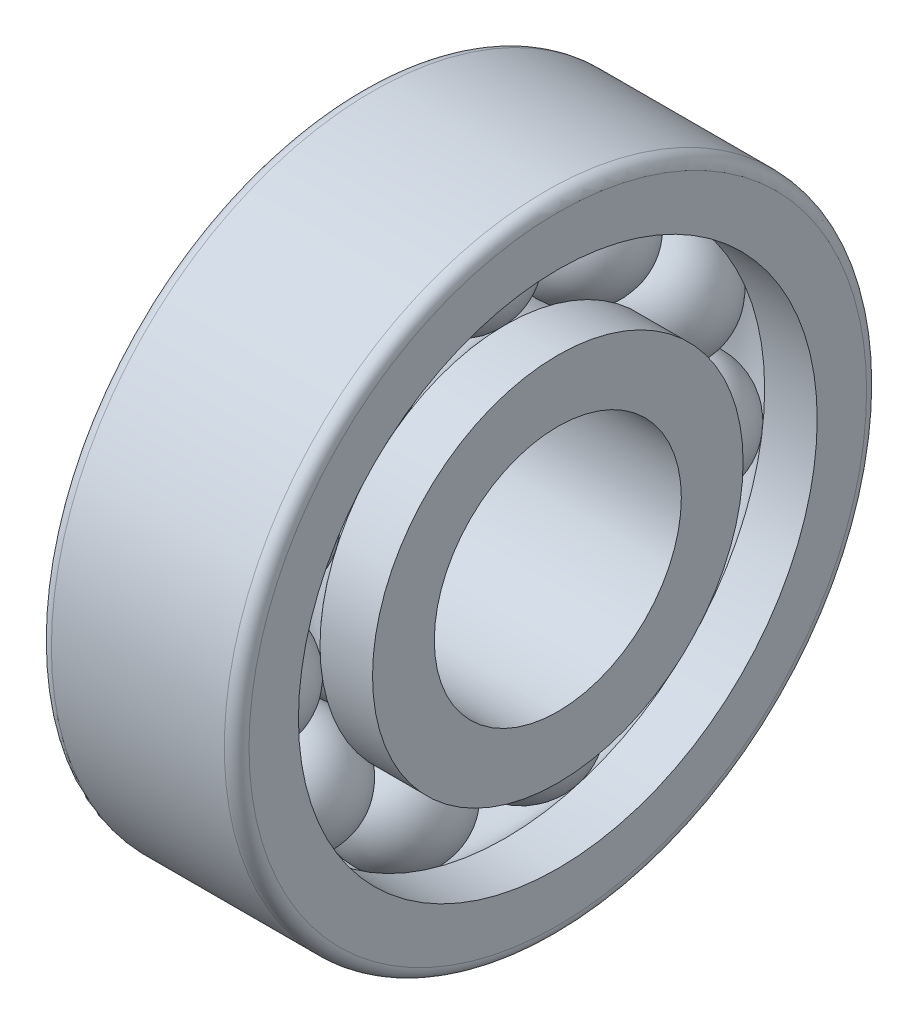
ISO-10303-21;
HEADER;
FILE_DESCRIPTION(('STEP AP214'),'2;1');
FILE_NAME('part.step','',(''),(''),'','','');
FILE_SCHEMA(('AUTOMOTIVE_DESIGN { 1 0 10303 214 1 1 1 1 }'));
ENDSEC;
DATA;
#1=APPLICATION_CONTEXT('core data for automotive mechanical design processes');
#2=APPLICATION_PROTOCOL_DEFINITION('international standard','automotive_design',2000,#1);
#3=PRODUCT_CONTEXT('',#1,'mechanical');
#4=PRODUCT('Part','Part','',(#3));
#5=PRODUCT_RELATED_PRODUCT_CATEGORY('part','',(#4));
#6=PRODUCT_DEFINITION_FORMATION('','',#4);
#7=PRODUCT_DEFINITION_CONTEXT('part definition',#1,'design');
#8=PRODUCT_DEFINITION('design','',#6,#7);
#9=PRODUCT_DEFINITION_SHAPE('','',#8);
#10=(LENGTH_UNIT() NAMED_UNIT(*) SI_UNIT(.MILLI.,.METRE.));
#11=(NAMED_UNIT(*) PLANE_ANGLE_UNIT() SI_UNIT($,.RADIAN.));
#12=(NAMED_UNIT(*) SI_UNIT($,.STERADIAN.) SOLID_ANGLE_UNIT());
#13=UNCERTAINTY_MEASURE_WITH_UNIT(LENGTH_MEASURE(1.E-05),#10,'distance_accuracy_value','');
#14=(GEOMETRIC_REPRESENTATION_CONTEXT(3) GLOBAL_UNCERTAINTY_ASSIGNED_CONTEXT((#13)) GLOBAL_UNIT_ASSIGNED_CONTEXT((#10,
#11,#12)) REPRESENTATION_CONTEXT('',''));
#15=CARTESIAN_POINT('',(0.,0.,0.));
#16=DIRECTION('',(0.,0.,1.));
#17=DIRECTION('',(1.,0.,0.));
#18=AXIS2_PLACEMENT_3D('',#15,#16,#17);
#19=CARTESIAN_POINT('',(-4.,7.57128179548069,-4.86576735710028));
#20=DIRECTION('',(-1.,0.,0.));
#21=DIRECTION('',(0.,0.841253532831188,-0.540640817455586));
#22=AXIS2_PLACEMENT_3D('',#19,#20,#21);
#23=SPHERICAL_SURFACE('',#22,2.4);
#24=CARTESIAN_POINT('',(-6.4,7.57128179548069,-4.86576735710028));
#25=VERTEX_POINT('',#24);
#26=VERTEX_LOOP('',#25);
#27=FACE_BOUND('',#26,.T.);
#28=ADVANCED_FACE('F39',(#27),#23,.T.);
#29=CLOSED_SHELL('',(#28));
#30=MANIFOLD_SOLID_BREP('B2',#29);
#31=CARTESIAN_POINT('',(-4.,3.73873511701707,-8.18668795819062));
#32=DIRECTION('',(-1.,0.,0.));
#33=DIRECTION('',(0.,0.415415013001897,-0.909631995354513));
#34=AXIS2_PLACEMENT_3D('',#31,#32,#33);
#35=SPHERICAL_SURFACE('',#34,2.4);
#36=CARTESIAN_POINT('',(-6.4,3.73873511701707,-8.18668795819062));
#37=VERTEX_POINT('',#36);
#38=VERTEX_LOOP('',#37);
#39=FACE_BOUND('',#38,.T.);
#40=ADVANCED_FACE('F59',(#39),#35,.T.);
#41=CLOSED_SHELL('',(#40));
#42=MANIFOLD_SOLID_BREP('B6',#41);
#43=CARTESIAN_POINT('',(-4.,-1.28083354445947,-8.90839297692841));
#44=DIRECTION('',(-1.,0.,0.));
#45=DIRECTION('',(0.,-0.142314838273275,-0.989821441880934));
#46=AXIS2_PLACEMENT_3D('',#43,#44,#45);
#47=SPHERICAL_SURFACE('',#46,2.4);
#48=CARTESIAN_POINT('',(-6.4,-1.28083354445947,-8.90839297692841));
#49=VERTEX_POINT('',#48);
#50=VERTEX_LOOP('',#49);
#51=FACE_BOUND('',#50,.T.);
#52=ADVANCED_FACE('F79',(#51),#47,.T.);
#53=CLOSED_SHELL('',(#52));
#54=MANIFOLD_SOLID_BREP('B35',#53);
#55=CARTESIAN_POINT('',(-4.,-5.8937466055075,-6.80174616918838));
#56=DIRECTION('',(-1.,0.,0.));
#57=DIRECTION('',(0.,-0.654860733945278,-0.755749574354264));
#58=AXIS2_PLACEMENT_3D('',#55,#56,#57);
#59=SPHERICAL_SURFACE('',#58,2.4);
#60=CARTESIAN_POINT('',(-6.4,-5.8937466055075,-6.80174616918838));
#61=VERTEX_POINT('',#60);
#62=VERTEX_LOOP('',#61);
#63=FACE_BOUND('',#62,.T.);
#64=ADVANCED_FACE('F99',(#63),#59,.T.);
#65=CLOSED_SHELL('',(#64));
#66=MANIFOLD_SOLID_BREP('B55',#65);
#67=CARTESIAN_POINT('',(-4.,-8.63543676253046,-2.53559301157293));
#68=DIRECTION('',(-1.,0.,0.));
#69=DIRECTION('',(0.,-0.959492973614495,-0.281732556841437));
#70=AXIS2_PLACEMENT_3D('',#67,#68,#69);
#71=SPHERICAL_SURFACE('',#70,2.4);
#72=CARTESIAN_POINT('',(-6.4,-8.63543676253046,-2.53559301157293));
#73=VERTEX_POINT('',#72);
#74=VERTEX_LOOP('',#73);
#75=FACE_BOUND('',#74,.T.);
#76=ADVANCED_FACE('F119',(#75),#71,.T.);
#77=CLOSED_SHELL('',(#76));
#78=MANIFOLD_SOLID_BREP('B75',#77);
#79=CARTESIAN_POINT('',(-4.,-8.63543676253049,2.53559301157281));
#80=DIRECTION('',(-1.,0.,0.));
#81=DIRECTION('',(0.,-0.959492973614499,0.281732556841423));
#82=AXIS2_PLACEMENT_3D('',#79,#80,#81);
#83=SPHERICAL_SURFACE('',#82,2.4);
#84=CARTESIAN_POINT('',(-6.4,-8.63543676253049,2.53559301157281));
#85=VERTEX_POINT('',#84);
#86=VERTEX_LOOP('',#85);
#87=FACE_BOUND('',#86,.T.);
#88=ADVANCED_FACE('F139',(#87),#83,.T.);
#89=CLOSED_SHELL('',(#88));
#90=MANIFOLD_SOLID_BREP('B95',#89);
#91=CARTESIAN_POINT('',(-4.,-5.8937466055076,6.80174616918829));
#92=DIRECTION('',(-1.,0.,0.));
#93=DIRECTION('',(0.,-0.654860733945289,0.755749574354255));
#94=AXIS2_PLACEMENT_3D('',#91,#92,#93);
#95=SPHERICAL_SURFACE('',#94,2.4);
#96=CARTESIAN_POINT('',(-6.4,-5.8937466055076,6.80174616918829));
#97=VERTEX_POINT('',#96);
#98=VERTEX_LOOP('',#97);
#99=FACE_BOUND('',#98,.T.);
#100=ADVANCED_FACE('F159',(#99),#95,.T.);
#101=CLOSED_SHELL('',(#100));
#102=MANIFOLD_SOLID_BREP('B115',#101);
#103=CARTESIAN_POINT('',(-4.,-1.2808335444596,8.90839297692839));
#104=DIRECTION('',(-1.,0.,0.));
#105=DIRECTION('',(0.,-0.142314838273289,0.989821441880932));
#106=AXIS2_PLACEMENT_3D('',#103,#104,#105);
#107=SPHERICAL_SURFACE('',#106,2.4);
#108=CARTESIAN_POINT('',(-6.4,-1.2808335444596,8.90839297692839));
#109=VERTEX_POINT('',#108);
#110=VERTEX_LOOP('',#109);
#111=FACE_BOUND('',#110,.T.);
#112=ADVANCED_FACE('F179',(#111),#107,.T.);
#113=CLOSED_SHELL('',(#112));
#114=MANIFOLD_SOLID_BREP('B135',#113);
#115=CARTESIAN_POINT('',(-4.,3.73873511701696,8.18668795819067));
#116=DIRECTION('',(-1.,0.,0.));
#117=DIRECTION('',(0.,0.415415013001884,0.909631995354519));
#118=AXIS2_PLACEMENT_3D('',#115,#116,#117);
#119=SPHERICAL_SURFACE('',#118,2.4);
#120=CARTESIAN_POINT('',(-6.4,3.73873511701696,8.18668795819067));
#121=VERTEX_POINT('',#120);
#122=VERTEX_LOOP('',#121);
#123=FACE_BOUND('',#122,.T.);
#124=ADVANCED_FACE('F199',(#123),#119,.T.);
#125=CLOSED_SHELL('',(#124));
#126=MANIFOLD_SOLID_BREP('B155',#125);
#127=CARTESIAN_POINT('',(-4.,7.57128179548062,4.86576735710039));
#128=DIRECTION('',(-1.,0.,0.));
#129=DIRECTION('',(0.,0.841253532831181,0.540640817455599));
#130=AXIS2_PLACEMENT_3D('',#127,#128,#129);
#131=SPHERICAL_SURFACE('',#130,2.4);
#132=CARTESIAN_POINT('',(-6.4,7.57128179548062,4.86576735710039));
#133=VERTEX_POINT('',#132);
#134=VERTEX_LOOP('',#133);
#135=FACE_BOUND('',#134,.T.);
#136=ADVANCED_FACE('F219',(#135),#131,.T.);
#137=CLOSED_SHELL('',(#136));
#138=MANIFOLD_SOLID_BREP('B175',#137);
#139=CARTESIAN_POINT('',(-4.,9.,0.));
#140=DIRECTION('',(-1.,0.,0.));
#141=DIRECTION('',(0.,1.,0.));
#142=AXIS2_PLACEMENT_3D('',#139,#140,#141);
#143=SPHERICAL_SURFACE('',#142,2.4);
#144=CARTESIAN_POINT('',(-6.4,9.,0.));
#145=VERTEX_POINT('',#144);
#146=VERTEX_LOOP('',#145);
#147=FACE_BOUND('',#146,.T.);
#148=ADVANCED_FACE('F241',(#147),#143,.T.);
#149=CLOSED_SHELL('',(#148));
#150=MANIFOLD_SOLID_BREP('B195',#149);
#151=CARTESIAN_POINT('',(-4.,0.,0.));
#152=DIRECTION('',(1.,0.,0.));
#153=DIRECTION('',(0.,0.,-1.));
#154=AXIS2_PLACEMENT_3D('',#151,#152,#153);
#155=TOROIDAL_SURFACE('',#154,9.,2.4);
#156=CARTESIAN_POINT('',(-5.87349939951952,0.,0.));
#157=DIRECTION('',(1.,0.,0.));
#158=DIRECTION('',(0.,0.,-1.));
#159=AXIS2_PLACEMENT_3D('',#156,#157,#158);
#160=CIRCLE('',#159,10.5);
#161=CARTESIAN_POINT('',(-5.87349939951952,0.,-10.5));
#162=VERTEX_POINT('',#161);
#163=EDGE_CURVE('E282',#162,#162,#160,.T.);
#164=ORIENTED_EDGE('',*,*,#163,.F.);
#165=EDGE_LOOP('',(#164));
#166=FACE_BOUND('',#165,.T.);
#167=CARTESIAN_POINT('',(-2.12650060048048,0.,0.));
#168=DIRECTION('',(1.,0.,0.));
#169=DIRECTION('',(0.,0.,-1.));
#170=AXIS2_PLACEMENT_3D('',#167,#168,#169);
#171=CIRCLE('',#170,10.5);
#172=CARTESIAN_POINT('',(-2.12650060048048,0.,-10.5));
#173=VERTEX_POINT('',#172);
#174=EDGE_CURVE('E291',#173,#173,#171,.T.);
#175=ORIENTED_EDGE('',*,*,#174,.T.);
#176=EDGE_LOOP('',(#175));
#177=FACE_BOUND('',#176,.T.);
#178=ADVANCED_FACE('F262',(#166,#177),#155,.F.);
#179=CARTESIAN_POINT('',(0.,0.,0.));
#180=DIRECTION('',(1.,0.,0.));
#181=DIRECTION('',(0.,0.,-1.));
#182=AXIS2_PLACEMENT_3D('',#179,#180,#181);
#183=CYLINDRICAL_SURFACE('',#182,10.5);
#184=CARTESIAN_POINT('',(0.,0.,0.));
#185=DIRECTION('',(1.,0.,0.));
#186=DIRECTION('',(0.,0.,-1.));
#187=AXIS2_PLACEMENT_3D('',#184,#185,#186);
#188=CIRCLE('',#187,10.5);
#189=CARTESIAN_POINT('',(0.,0.,-10.5));
#190=VERTEX_POINT('',#189);
#191=EDGE_CURVE('E288',#190,#190,#188,.T.);
#192=ORIENTED_EDGE('',*,*,#191,.T.);
#193=EDGE_LOOP('',(#192));
#194=FACE_BOUND('',#193,.T.);
#195=ORIENTED_EDGE('',*,*,#174,.F.);
#196=EDGE_LOOP('',(#195));
#197=FACE_BOUND('',#196,.T.);
#198=ADVANCED_FACE('F296',(#194,#197),#183,.F.);
#199=CARTESIAN_POINT('',(0.,0.,0.));
#200=DIRECTION('',(1.,0.,0.));
#201=DIRECTION('',(0.,0.,-1.));
#202=AXIS2_PLACEMENT_3D('',#199,#200,#201);
#203=PLANE('',#202);
#204=CARTESIAN_POINT('',(0.,0.,0.));
#205=DIRECTION('',(1.,0.,0.));
#206=DIRECTION('',(0.,0.,-1.));
#207=AXIS2_PLACEMENT_3D('',#204,#205,#206);
#208=CIRCLE('',#207,12.5);
#209=CARTESIAN_POINT('',(0.,0.,-12.5));
#210=VERTEX_POINT('',#209);
#211=EDGE_CURVE('E240',#210,#210,#208,.T.);
#212=ORIENTED_EDGE('',*,*,#211,.T.);
#213=EDGE_LOOP('',(#212));
#214=FACE_BOUND('',#213,.T.);
#215=ORIENTED_EDGE('',*,*,#191,.F.);
#216=EDGE_LOOP('',(#215));
#217=FACE_BOUND('',#216,.T.);
#218=ADVANCED_FACE('F298',(#214,#217),#203,.T.);
#219=CARTESIAN_POINT('',(0.,0.,0.));
#220=DIRECTION('',(1.,0.,0.));
#221=DIRECTION('',(0.,0.,-1.));
#222=AXIS2_PLACEMENT_3D('',#219,#220,#221);
#223=CYLINDRICAL_SURFACE('',#222,13.);
#224=CARTESIAN_POINT('',(-7.5,0.,0.));
#225=DIRECTION('',(-1.,0.,0.));
#226=DIRECTION('',(0.,0.,1.));
#227=AXIS2_PLACEMENT_3D('',#224,#225,#226);
#228=CIRCLE('',#227,13.);
#229=CARTESIAN_POINT('',(-7.5,0.,13.));
#230=VERTEX_POINT('',#229);
#231=EDGE_CURVE('E273',#230,#230,#228,.F.);
#232=ORIENTED_EDGE('',*,*,#231,.T.);
#233=EDGE_LOOP('',(#232));
#234=FACE_BOUND('',#233,.T.);
#235=CARTESIAN_POINT('',(-0.5,0.,0.));
#236=DIRECTION('',(1.,0.,0.));
#237=DIRECTION('',(0.,0.,-1.));
#238=AXIS2_PLACEMENT_3D('',#235,#236,#237);
#239=CIRCLE('',#238,13.);
#240=CARTESIAN_POINT('',(-0.5,0.,-13.));
#241=VERTEX_POINT('',#240);
#242=EDGE_CURVE('E277',#241,#241,#239,.F.);
#243=ORIENTED_EDGE('',*,*,#242,.T.);
#244=EDGE_LOOP('',(#243));
#245=FACE_BOUND('',#244,.T.);
#246=ADVANCED_FACE('F305',(#234,#245),#223,.T.);
#247=CARTESIAN_POINT('',(-8.,0.,0.));
#248=DIRECTION('',(-1.,0.,0.));
#249=DIRECTION('',(0.,0.,1.));
#250=AXIS2_PLACEMENT_3D('',#247,#248,#249);
#251=PLANE('',#250);
#252=CARTESIAN_POINT('',(-8.,0.,0.));
#253=DIRECTION('',(-1.,0.,0.));
#254=DIRECTION('',(0.,0.,1.));
#255=AXIS2_PLACEMENT_3D('',#252,#253,#254);
#256=CIRCLE('',#255,12.5);
#257=CARTESIAN_POINT('',(-8.,0.,12.5));
#258=VERTEX_POINT('',#257);
#259=EDGE_CURVE('E269',#258,#258,#256,.T.);
#260=ORIENTED_EDGE('',*,*,#259,.T.);
#261=EDGE_LOOP('',(#260));
#262=FACE_BOUND('',#261,.T.);
#263=CARTESIAN_POINT('',(-8.,0.,0.));
#264=DIRECTION('',(1.,0.,0.));
#265=DIRECTION('',(0.,0.,-1.));
#266=AXIS2_PLACEMENT_3D('',#263,#264,#265);
#267=CIRCLE('',#266,10.5);
#268=CARTESIAN_POINT('',(-8.,0.,-10.5));
#269=VERTEX_POINT('',#268);
#270=EDGE_CURVE('E285',#269,#269,#267,.T.);
#271=ORIENTED_EDGE('',*,*,#270,.T.);
#272=EDGE_LOOP('',(#271));
#273=FACE_BOUND('',#272,.T.);
#274=ADVANCED_FACE('F312',(#262,#273),#251,.T.);
#275=CARTESIAN_POINT('',(0.,0.,0.));
#276=DIRECTION('',(1.,0.,0.));
#277=DIRECTION('',(0.,0.,-1.));
#278=AXIS2_PLACEMENT_3D('',#275,#276,#277);
#279=CYLINDRICAL_SURFACE('',#278,10.5);
#280=ORIENTED_EDGE('',*,*,#163,.T.);
#281=EDGE_LOOP('',(#280));
#282=FACE_BOUND('',#281,.T.);
#283=ORIENTED_EDGE('',*,*,#270,.F.);
#284=EDGE_LOOP('',(#283));
#285=FACE_BOUND('',#284,.T.);
#286=ADVANCED_FACE('F316',(#282,#285),#279,.F.);
#287=CARTESIAN_POINT('',(-7.5,0.,0.));
#288=DIRECTION('',(-1.,0.,0.));
#289=DIRECTION('',(0.,0.,1.));
#290=AXIS2_PLACEMENT_3D('',#287,#288,#289);
#291=TOROIDAL_SURFACE('',#290,12.5,0.5);
#292=ORIENTED_EDGE('',*,*,#259,.F.);
#293=EDGE_LOOP('',(#292));
#294=FACE_BOUND('',#293,.T.);
#295=ORIENTED_EDGE('',*,*,#231,.F.);
#296=EDGE_LOOP('',(#295));
#297=FACE_BOUND('',#296,.T.);
#298=ADVANCED_FACE('F318',(#294,#297),#291,.T.);
#299=CARTESIAN_POINT('',(-0.5,0.,0.));
#300=DIRECTION('',(1.,0.,0.));
#301=DIRECTION('',(0.,0.,-1.));
#302=AXIS2_PLACEMENT_3D('',#299,#300,#301);
#303=TOROIDAL_SURFACE('',#302,12.5,0.5);
#304=ORIENTED_EDGE('',*,*,#242,.F.);
#305=EDGE_LOOP('',(#304));
#306=FACE_BOUND('',#305,.T.);
#307=ORIENTED_EDGE('',*,*,#211,.F.);
#308=EDGE_LOOP('',(#307));
#309=FACE_BOUND('',#308,.T.);
#310=ADVANCED_FACE('F264',(#306,#309),#303,.T.);
#311=CLOSED_SHELL('',(#178,#198,#218,#246,#274,#286,#298,#310));
#312=MANIFOLD_SOLID_BREP('B215',#311);
#313=CARTESIAN_POINT('',(-4.,0.,0.));
#314=DIRECTION('',(1.,0.,0.));
#315=DIRECTION('',(0.,0.,-1.));
#316=AXIS2_PLACEMENT_3D('',#313,#314,#315);
#317=TOROIDAL_SURFACE('',#316,9.,2.4);
#318=CARTESIAN_POINT('',(-2.12650060048048,0.,0.));
#319=DIRECTION('',(1.,0.,0.));
#320=DIRECTION('',(0.,0.,-1.));
#321=AXIS2_PLACEMENT_3D('',#318,#319,#320);
#322=CIRCLE('',#321,7.5);
#323=CARTESIAN_POINT('',(-2.12650060048048,0.,-7.5));
#324=VERTEX_POINT('',#323);
#325=EDGE_CURVE('E408',#324,#324,#322,.T.);
#326=ORIENTED_EDGE('',*,*,#325,.F.);
#327=EDGE_LOOP('',(#326));
#328=FACE_BOUND('',#327,.T.);
#329=CARTESIAN_POINT('',(-5.87349939951952,0.,0.));
#330=DIRECTION('',(1.,0.,0.));
#331=DIRECTION('',(0.,0.,-1.));
#332=AXIS2_PLACEMENT_3D('',#329,#330,#331);
#333=CIRCLE('',#332,7.5);
#334=CARTESIAN_POINT('',(-5.87349939951952,0.,-7.5));
#335=VERTEX_POINT('',#334);
#336=EDGE_CURVE('E261',#335,#335,#333,.T.);
#337=ORIENTED_EDGE('',*,*,#336,.T.);
#338=EDGE_LOOP('',(#337));
#339=FACE_BOUND('',#338,.T.);
#340=ADVANCED_FACE('F386',(#328,#339),#317,.F.);
#341=CARTESIAN_POINT('',(0.,0.,0.));
#342=DIRECTION('',(1.,0.,0.));
#343=DIRECTION('',(0.,0.,-1.));
#344=AXIS2_PLACEMENT_3D('',#341,#342,#343);
#345=CYLINDRICAL_SURFACE('',#344,7.5);
#346=ORIENTED_EDGE('',*,*,#336,.F.);
#347=EDGE_LOOP('',(#346));
#348=FACE_BOUND('',#347,.T.);
#349=CARTESIAN_POINT('',(-8.,0.,0.));
#350=DIRECTION('',(1.,0.,0.));
#351=DIRECTION('',(0.,0.,-1.));
#352=AXIS2_PLACEMENT_3D('',#349,#350,#351);
#353=CIRCLE('',#352,7.5);
#354=CARTESIAN_POINT('',(-8.,0.,-7.5));
#355=VERTEX_POINT('',#354);
#356=EDGE_CURVE('E392',#355,#355,#353,.T.);
#357=ORIENTED_EDGE('',*,*,#356,.T.);
#358=EDGE_LOOP('',(#357));
#359=FACE_BOUND('',#358,.T.);
#360=ADVANCED_FACE('F415',(#348,#359),#345,.T.);
#361=CARTESIAN_POINT('',(-8.,0.,0.));
#362=DIRECTION('',(1.,0.,0.));
#363=DIRECTION('',(0.,0.,-1.));
#364=AXIS2_PLACEMENT_3D('',#361,#362,#363);
#365=PLANE('',#364);
#366=ORIENTED_EDGE('',*,*,#356,.F.);
#367=EDGE_LOOP('',(#366));
#368=FACE_BOUND('',#367,.T.);
#369=CARTESIAN_POINT('',(-8.,0.,0.));
#370=DIRECTION('',(1.,0.,0.));
#371=DIRECTION('',(0.,0.,-1.));
#372=AXIS2_PLACEMENT_3D('',#369,#370,#371);
#373=CIRCLE('',#372,5.);
#374=CARTESIAN_POINT('',(-8.,0.,-5.));
#375=VERTEX_POINT('',#374);
#376=EDGE_CURVE('E396',#375,#375,#373,.T.);
#377=ORIENTED_EDGE('',*,*,#376,.T.);
#378=EDGE_LOOP('',(#377));
#379=FACE_BOUND('',#378,.T.);
#380=ADVANCED_FACE('F419',(#368,#379),#365,.F.);
#381=CARTESIAN_POINT('',(0.,0.,0.));
#382=DIRECTION('',(1.,0.,0.));
#383=DIRECTION('',(0.,0.,-1.));
#384=AXIS2_PLACEMENT_3D('',#381,#382,#383);
#385=CYLINDRICAL_SURFACE('',#384,5.);
#386=ORIENTED_EDGE('',*,*,#376,.F.);
#387=EDGE_LOOP('',(#386));
#388=FACE_BOUND('',#387,.T.);
#389=CARTESIAN_POINT('',(0.,0.,0.));
#390=DIRECTION('',(1.,0.,0.));
#391=DIRECTION('',(0.,0.,-1.));
#392=AXIS2_PLACEMENT_3D('',#389,#390,#391);
#393=CIRCLE('',#392,5.);
#394=CARTESIAN_POINT('',(0.,0.,-5.));
#395=VERTEX_POINT('',#394);
#396=EDGE_CURVE('E400',#395,#395,#393,.T.);
#397=ORIENTED_EDGE('',*,*,#396,.T.);
#398=EDGE_LOOP('',(#397));
#399=FACE_BOUND('',#398,.T.);
#400=ADVANCED_FACE('F424',(#388,#399),#385,.F.);
#401=CARTESIAN_POINT('',(0.,0.,0.));
#402=DIRECTION('',(-1.,0.,0.));
#403=DIRECTION('',(0.,0.,1.));
#404=AXIS2_PLACEMENT_3D('',#401,#402,#403);
#405=PLANE('',#404);
#406=ORIENTED_EDGE('',*,*,#396,.F.);
#407=EDGE_LOOP('',(#406));
#408=FACE_BOUND('',#407,.T.);
#409=CARTESIAN_POINT('',(0.,0.,0.));
#410=DIRECTION('',(1.,0.,0.));
#411=DIRECTION('',(0.,0.,-1.));
#412=AXIS2_PLACEMENT_3D('',#409,#410,#411);
#413=CIRCLE('',#412,7.5);
#414=CARTESIAN_POINT('',(0.,0.,-7.5));
#415=VERTEX_POINT('',#414);
#416=EDGE_CURVE('E405',#415,#415,#413,.T.);
#417=ORIENTED_EDGE('',*,*,#416,.T.);
#418=EDGE_LOOP('',(#417));
#419=FACE_BOUND('',#418,.T.);
#420=ADVANCED_FACE('F430',(#408,#419),#405,.F.);
#421=CARTESIAN_POINT('',(0.,0.,0.));
#422=DIRECTION('',(1.,0.,0.));
#423=DIRECTION('',(0.,0.,-1.));
#424=AXIS2_PLACEMENT_3D('',#421,#422,#423);
#425=CYLINDRICAL_SURFACE('',#424,7.5);
#426=ORIENTED_EDGE('',*,*,#416,.F.);
#427=EDGE_LOOP('',(#426));
#428=FACE_BOUND('',#427,.T.);
#429=ORIENTED_EDGE('',*,*,#325,.T.);
#430=EDGE_LOOP('',(#429));
#431=FACE_BOUND('',#430,.T.);
#432=ADVANCED_FACE('F412',(#428,#431),#425,.T.);
#433=CLOSED_SHELL('',(#340,#360,#380,#400,#420,#432));
#434=MANIFOLD_SOLID_BREP('B235',#433);
#435=ADVANCED_BREP_SHAPE_REPRESENTATION('',(#18,#30,#42,#54,#66,#78,#90,#102,#114,#126,#138,
#150,#312,#434),#14);
#436=SHAPE_DEFINITION_REPRESENTATION(#9,#435);
ENDSEC;
END-ISO-10303-21;
